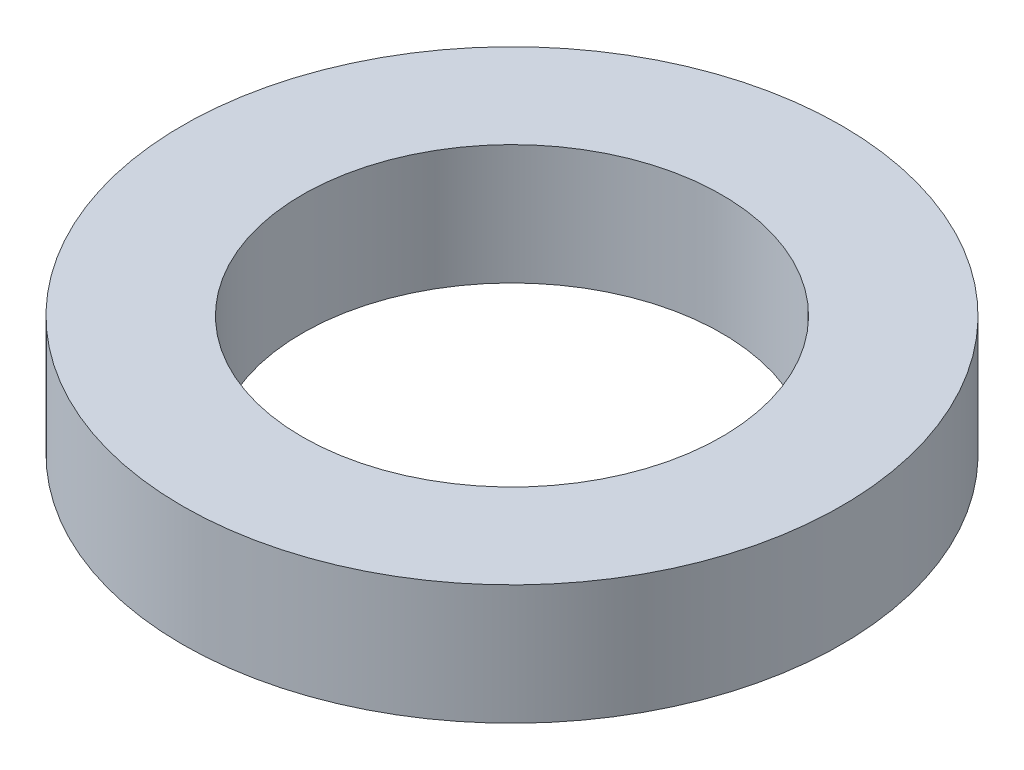
ISO-10303-21;
HEADER;
FILE_DESCRIPTION(('STEP AP214'),'2;1');
FILE_NAME('part.step','',(''),(''),'','','');
FILE_SCHEMA(('AUTOMOTIVE_DESIGN { 1 0 10303 214 1 1 1 1 }'));
ENDSEC;
DATA;
#1=APPLICATION_CONTEXT('core data for automotive mechanical design processes');
#2=APPLICATION_PROTOCOL_DEFINITION('international standard','automotive_design',2000,#1);
#3=PRODUCT_CONTEXT('',#1,'mechanical');
#4=PRODUCT('Part','Part','',(#3));
#5=PRODUCT_RELATED_PRODUCT_CATEGORY('part','',(#4));
#6=PRODUCT_DEFINITION_FORMATION('','',#4);
#7=PRODUCT_DEFINITION_CONTEXT('part definition',#1,'design');
#8=PRODUCT_DEFINITION('design','',#6,#7);
#9=PRODUCT_DEFINITION_SHAPE('','',#8);
#10=(LENGTH_UNIT() NAMED_UNIT(*) SI_UNIT(.MILLI.,.METRE.));
#11=(NAMED_UNIT(*) PLANE_ANGLE_UNIT() SI_UNIT($,.RADIAN.));
#12=(NAMED_UNIT(*) SI_UNIT($,.STERADIAN.) SOLID_ANGLE_UNIT());
#13=UNCERTAINTY_MEASURE_WITH_UNIT(LENGTH_MEASURE(1.E-05),#10,'distance_accuracy_value','');
#14=(GEOMETRIC_REPRESENTATION_CONTEXT(3) GLOBAL_UNCERTAINTY_ASSIGNED_CONTEXT((#13)) GLOBAL_UNIT_ASSIGNED_CONTEXT((#10,
#11,#12)) REPRESENTATION_CONTEXT('',''));
#15=CARTESIAN_POINT('',(0.,0.,0.));
#16=DIRECTION('',(0.,0.,1.));
#17=DIRECTION('',(1.,0.,0.));
#18=AXIS2_PLACEMENT_3D('',#15,#16,#17);
#19=CARTESIAN_POINT('',(0.,1.,0.));
#20=DIRECTION('',(0.,1.,0.));
#21=DIRECTION('',(0.,0.,1.));
#22=AXIS2_PLACEMENT_3D('',#19,#20,#21);
#23=PLANE('',#22);
#24=CARTESIAN_POINT('',(0.,1.,0.));
#25=DIRECTION('',(0.,1.,0.));
#26=DIRECTION('',(0.,0.,1.));
#27=AXIS2_PLACEMENT_3D('',#24,#25,#26);
#28=CIRCLE('',#27,2.75);
#29=CARTESIAN_POINT('',(0.,1.,2.75));
#30=VERTEX_POINT('',#29);
#31=EDGE_CURVE('E10',#30,#30,#28,.T.);
#32=ORIENTED_EDGE('',*,*,#31,.T.);
#33=EDGE_LOOP('',(#32));
#34=FACE_BOUND('',#33,.T.);
#35=CARTESIAN_POINT('',(0.,1.,0.));
#36=DIRECTION('',(0.,1.,0.));
#37=DIRECTION('',(0.,0.,1.));
#38=AXIS2_PLACEMENT_3D('',#35,#36,#37);
#39=CIRCLE('',#38,1.75);
#40=CARTESIAN_POINT('',(0.,1.,1.75));
#41=VERTEX_POINT('',#40);
#42=EDGE_CURVE('E42',#41,#41,#39,.T.);
#43=ORIENTED_EDGE('',*,*,#42,.F.);
#44=EDGE_LOOP('',(#43));
#45=FACE_BOUND('',#44,.T.);
#46=ADVANCED_FACE('F31',(#34,#45),#23,.T.);
#47=CARTESIAN_POINT('',(0.,0.,0.));
#48=DIRECTION('',(0.,1.,0.));
#49=DIRECTION('',(0.,0.,1.));
#50=AXIS2_PLACEMENT_3D('',#47,#48,#49);
#51=PLANE('',#50);
#52=CARTESIAN_POINT('',(0.,0.,0.));
#53=DIRECTION('',(0.,1.,0.));
#54=DIRECTION('',(0.,0.,1.));
#55=AXIS2_PLACEMENT_3D('',#52,#53,#54);
#56=CIRCLE('',#55,2.75);
#57=CARTESIAN_POINT('',(0.,0.,2.75));
#58=VERTEX_POINT('',#57);
#59=EDGE_CURVE('E35',#58,#58,#56,.T.);
#60=ORIENTED_EDGE('',*,*,#59,.F.);
#61=EDGE_LOOP('',(#60));
#62=FACE_BOUND('',#61,.T.);
#63=CARTESIAN_POINT('',(0.,0.,0.));
#64=DIRECTION('',(0.,1.,0.));
#65=DIRECTION('',(0.,0.,1.));
#66=AXIS2_PLACEMENT_3D('',#63,#64,#65);
#67=CIRCLE('',#66,1.75);
#68=CARTESIAN_POINT('',(0.,0.,1.75));
#69=VERTEX_POINT('',#68);
#70=EDGE_CURVE('E44',#69,#69,#67,.T.);
#71=ORIENTED_EDGE('',*,*,#70,.T.);
#72=EDGE_LOOP('',(#71));
#73=FACE_BOUND('',#72,.T.);
#74=ADVANCED_FACE('F54',(#62,#73),#51,.F.);
#75=CARTESIAN_POINT('',(0.,1.,0.));
#76=DIRECTION('',(0.,-1.,0.));
#77=DIRECTION('',(0.,0.,-1.));
#78=AXIS2_PLACEMENT_3D('',#75,#76,#77);
#79=CYLINDRICAL_SURFACE('',#78,2.75);
#80=ORIENTED_EDGE('',*,*,#31,.F.);
#81=EDGE_LOOP('',(#80));
#82=FACE_BOUND('',#81,.T.);
#83=ORIENTED_EDGE('',*,*,#59,.T.);
#84=EDGE_LOOP('',(#83));
#85=FACE_BOUND('',#84,.T.);
#86=ADVANCED_FACE('F33',(#82,#85),#79,.T.);
#87=CARTESIAN_POINT('',(0.,1.,0.));
#88=DIRECTION('',(0.,-1.,0.));
#89=DIRECTION('',(0.,0.,-1.));
#90=AXIS2_PLACEMENT_3D('',#87,#88,#89);
#91=CYLINDRICAL_SURFACE('',#90,1.75);
#92=ORIENTED_EDGE('',*,*,#42,.T.);
#93=EDGE_LOOP('',(#92));
#94=FACE_BOUND('',#93,.T.);
#95=ORIENTED_EDGE('',*,*,#70,.F.);
#96=EDGE_LOOP('',(#95));
#97=FACE_BOUND('',#96,.T.);
#98=ADVANCED_FACE('F50',(#94,#97),#91,.F.);
#99=CLOSED_SHELL('',(#46,#74,#86,#98));
#100=MANIFOLD_SOLID_BREP('B2',#99);
#101=ADVANCED_BREP_SHAPE_REPRESENTATION('',(#18,#100),#14);
#102=SHAPE_DEFINITION_REPRESENTATION(#9,#101);
ENDSEC;
END-ISO-10303-21;
